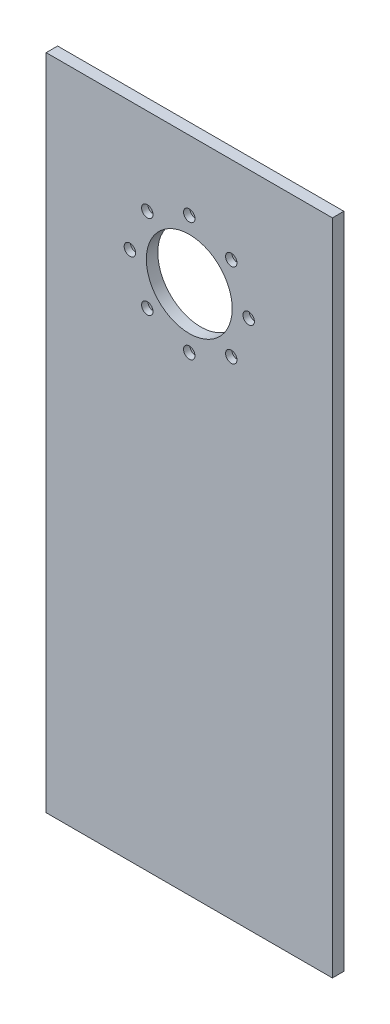
ISO-10303-21;
HEADER;
FILE_DESCRIPTION(('STEP AP214'),'2;1');
FILE_NAME('part.step','',(''),(''),'','','');
FILE_SCHEMA(('AUTOMOTIVE_DESIGN { 1 0 10303 214 1 1 1 1 }'));
ENDSEC;
DATA;
#1=APPLICATION_CONTEXT('core data for automotive mechanical design processes');
#2=APPLICATION_PROTOCOL_DEFINITION('international standard','automotive_design',2000,#1);
#3=PRODUCT_CONTEXT('',#1,'mechanical');
#4=PRODUCT('Part','Part','',(#3));
#5=PRODUCT_RELATED_PRODUCT_CATEGORY('part','',(#4));
#6=PRODUCT_DEFINITION_FORMATION('','',#4);
#7=PRODUCT_DEFINITION_CONTEXT('part definition',#1,'design');
#8=PRODUCT_DEFINITION('design','',#6,#7);
#9=PRODUCT_DEFINITION_SHAPE('','',#8);
#10=(LENGTH_UNIT() NAMED_UNIT(*) SI_UNIT(.MILLI.,.METRE.));
#11=(NAMED_UNIT(*) PLANE_ANGLE_UNIT() SI_UNIT($,.RADIAN.));
#12=(NAMED_UNIT(*) SI_UNIT($,.STERADIAN.) SOLID_ANGLE_UNIT());
#13=UNCERTAINTY_MEASURE_WITH_UNIT(LENGTH_MEASURE(1.E-05),#10,'distance_accuracy_value','');
#14=(GEOMETRIC_REPRESENTATION_CONTEXT(3) GLOBAL_UNCERTAINTY_ASSIGNED_CONTEXT((#13)) GLOBAL_UNIT_ASSIGNED_CONTEXT((#10,
#11,#12)) REPRESENTATION_CONTEXT('',''));
#15=CARTESIAN_POINT('',(0.,0.,0.));
#16=DIRECTION('',(0.,0.,1.));
#17=DIRECTION('',(1.,0.,0.));
#18=AXIS2_PLACEMENT_3D('',#15,#16,#17);
#19=CARTESIAN_POINT('',(29.3449314192411,399.344931419241,10.));
#20=DIRECTION('',(0.,0.,-1.));
#21=DIRECTION('',(-1.,0.,0.));
#22=AXIS2_PLACEMENT_3D('',#19,#20,#21);
#23=CYLINDRICAL_SURFACE('',#22,2.25000000000001);
#24=CARTESIAN_POINT('',(29.3449314192411,399.344931419241,0.));
#25=DIRECTION('',(0.,0.,-1.));
#26=DIRECTION('',(-1.,0.,0.));
#27=AXIS2_PLACEMENT_3D('',#24,#25,#26);
#28=CIRCLE('',#27,2.25000000000001);
#29=CARTESIAN_POINT('',(27.0949314192411,399.344931419241,0.));
#30=VERTEX_POINT('',#29);
#31=EDGE_CURVE('E134',#30,#30,#28,.T.);
#32=ORIENTED_EDGE('',*,*,#31,.T.);
#33=EDGE_LOOP('',(#32));
#34=FACE_BOUND('',#33,.T.);
#35=CARTESIAN_POINT('',(29.3449314192411,399.344931419241,3.6));
#36=DIRECTION('',(0.,0.,1.));
#37=DIRECTION('',(1.,0.,0.));
#38=AXIS2_PLACEMENT_3D('',#35,#36,#37);
#39=CIRCLE('',#38,2.25000000000001);
#40=CARTESIAN_POINT('',(31.5949314192411,399.344931419241,3.6));
#41=VERTEX_POINT('',#40);
#42=EDGE_CURVE('E39',#41,#41,#39,.F.);
#43=ORIENTED_EDGE('',*,*,#42,.F.);
#44=EDGE_LOOP('',(#43));
#45=FACE_BOUND('',#44,.T.);
#46=ADVANCED_FACE('F35',(#34,#45),#23,.F.);
#47=CARTESIAN_POINT('',(41.4999999999988,369.999999999999,10.));
#48=DIRECTION('',(0.,0.,-1.));
#49=DIRECTION('',(-1.,0.,0.));
#50=AXIS2_PLACEMENT_3D('',#47,#48,#49);
#51=CYLINDRICAL_SURFACE('',#50,2.25000000000001);
#52=CARTESIAN_POINT('',(41.4999999999988,369.999999999999,0.));
#53=DIRECTION('',(0.,0.,-1.));
#54=DIRECTION('',(-1.,0.,0.));
#55=AXIS2_PLACEMENT_3D('',#52,#53,#54);
#56=CIRCLE('',#55,2.25000000000001);
#57=CARTESIAN_POINT('',(39.2499999999988,369.999999999999,0.));
#58=VERTEX_POINT('',#57);
#59=EDGE_CURVE('E138',#58,#58,#56,.T.);
#60=ORIENTED_EDGE('',*,*,#59,.T.);
#61=EDGE_LOOP('',(#60));
#62=FACE_BOUND('',#61,.T.);
#63=CARTESIAN_POINT('',(41.4999999999988,369.999999999999,3.6));
#64=DIRECTION('',(0.,0.,1.));
#65=DIRECTION('',(1.,0.,0.));
#66=AXIS2_PLACEMENT_3D('',#63,#64,#65);
#67=CIRCLE('',#66,2.25000000000001);
#68=CARTESIAN_POINT('',(43.7499999999988,369.999999999999,3.6));
#69=VERTEX_POINT('',#68);
#70=EDGE_CURVE('E129',#69,#69,#67,.F.);
#71=ORIENTED_EDGE('',*,*,#70,.F.);
#72=EDGE_LOOP('',(#71));
#73=FACE_BOUND('',#72,.T.);
#74=ADVANCED_FACE('F175',(#62,#73),#51,.F.);
#75=CARTESIAN_POINT('',(29.3449314192399,340.655068580758,10.));
#76=DIRECTION('',(0.,0.,-1.));
#77=DIRECTION('',(-1.,0.,0.));
#78=AXIS2_PLACEMENT_3D('',#75,#76,#77);
#79=CYLINDRICAL_SURFACE('',#78,2.24999999999998);
#80=CARTESIAN_POINT('',(29.3449314192399,340.655068580758,0.));
#81=DIRECTION('',(0.,0.,-1.));
#82=DIRECTION('',(-1.,0.,0.));
#83=AXIS2_PLACEMENT_3D('',#80,#81,#82);
#84=CIRCLE('',#83,2.24999999999998);
#85=CARTESIAN_POINT('',(27.0949314192399,340.655068580758,0.));
#86=VERTEX_POINT('',#85);
#87=EDGE_CURVE('E143',#86,#86,#84,.T.);
#88=ORIENTED_EDGE('',*,*,#87,.T.);
#89=EDGE_LOOP('',(#88));
#90=FACE_BOUND('',#89,.T.);
#91=CARTESIAN_POINT('',(29.3449314192399,340.655068580758,3.6));
#92=DIRECTION('',(0.,0.,1.));
#93=DIRECTION('',(1.,0.,0.));
#94=AXIS2_PLACEMENT_3D('',#91,#92,#93);
#95=CIRCLE('',#94,2.24999999999998);
#96=CARTESIAN_POINT('',(31.5949314192399,340.655068580758,3.6));
#97=VERTEX_POINT('',#96);
#98=EDGE_CURVE('E127',#97,#97,#95,.F.);
#99=ORIENTED_EDGE('',*,*,#98,.F.);
#100=EDGE_LOOP('',(#99));
#101=FACE_BOUND('',#100,.T.);
#102=ADVANCED_FACE('F181',(#90,#101),#79,.F.);
#103=CARTESIAN_POINT('',(-2.04887979473371E-12,328.5,10.));
#104=DIRECTION('',(0.,0.,-1.));
#105=DIRECTION('',(-1.,0.,0.));
#106=AXIS2_PLACEMENT_3D('',#103,#104,#105);
#107=CYLINDRICAL_SURFACE('',#106,2.25000000000001);
#108=CARTESIAN_POINT('',(-2.04887979473371E-12,328.5,0.));
#109=DIRECTION('',(0.,0.,-1.));
#110=DIRECTION('',(-1.,0.,0.));
#111=AXIS2_PLACEMENT_3D('',#108,#109,#110);
#112=CIRCLE('',#111,2.25000000000001);
#113=CARTESIAN_POINT('',(-2.25000000000205,328.5,0.));
#114=VERTEX_POINT('',#113);
#115=EDGE_CURVE('E276',#114,#114,#112,.T.);
#116=ORIENTED_EDGE('',*,*,#115,.T.);
#117=EDGE_LOOP('',(#116));
#118=FACE_BOUND('',#117,.T.);
#119=CARTESIAN_POINT('',(-2.04887979473371E-12,328.5,3.6));
#120=DIRECTION('',(0.,0.,1.));
#121=DIRECTION('',(1.,0.,0.));
#122=AXIS2_PLACEMENT_3D('',#119,#120,#121);
#123=CIRCLE('',#122,2.25000000000001);
#124=CARTESIAN_POINT('',(2.24999999999796,328.5,3.6));
#125=VERTEX_POINT('',#124);
#126=EDGE_CURVE('E124',#125,#125,#123,.F.);
#127=ORIENTED_EDGE('',*,*,#126,.F.);
#128=EDGE_LOOP('',(#127));
#129=FACE_BOUND('',#128,.T.);
#130=ADVANCED_FACE('F262',(#118,#129),#107,.F.);
#131=CARTESIAN_POINT('',(-29.3449314192435,340.655068580759,10.));
#132=DIRECTION('',(0.,0.,-1.));
#133=DIRECTION('',(-1.,0.,0.));
#134=AXIS2_PLACEMENT_3D('',#131,#132,#133);
#135=CYLINDRICAL_SURFACE('',#134,2.24999999999998);
#136=CARTESIAN_POINT('',(-29.3449314192435,340.655068580759,0.));
#137=DIRECTION('',(0.,0.,-1.));
#138=DIRECTION('',(-1.,0.,0.));
#139=AXIS2_PLACEMENT_3D('',#136,#137,#138);
#140=CIRCLE('',#139,2.24999999999998);
#141=CARTESIAN_POINT('',(-31.5949314192435,340.655068580759,0.));
#142=VERTEX_POINT('',#141);
#143=EDGE_CURVE('E278',#142,#142,#140,.T.);
#144=ORIENTED_EDGE('',*,*,#143,.T.);
#145=EDGE_LOOP('',(#144));
#146=FACE_BOUND('',#145,.T.);
#147=CARTESIAN_POINT('',(-29.3449314192435,340.655068580759,3.6));
#148=DIRECTION('',(0.,0.,1.));
#149=DIRECTION('',(1.,0.,0.));
#150=AXIS2_PLACEMENT_3D('',#147,#148,#149);
#151=CIRCLE('',#150,2.24999999999998);
#152=CARTESIAN_POINT('',(-27.0949314192436,340.655068580759,3.6));
#153=VERTEX_POINT('',#152);
#154=EDGE_CURVE('E121',#153,#153,#151,.F.);
#155=ORIENTED_EDGE('',*,*,#154,.F.);
#156=EDGE_LOOP('',(#155));
#157=FACE_BOUND('',#156,.T.);
#158=ADVANCED_FACE('F258',(#146,#157),#135,.F.);
#159=CARTESIAN_POINT('',(-41.5000000000011,370.000000000001,10.));
#160=DIRECTION('',(0.,0.,-1.));
#161=DIRECTION('',(-1.,0.,0.));
#162=AXIS2_PLACEMENT_3D('',#159,#160,#161);
#163=CYLINDRICAL_SURFACE('',#162,2.25000000000001);
#164=CARTESIAN_POINT('',(-41.5000000000011,370.000000000001,0.));
#165=DIRECTION('',(0.,0.,-1.));
#166=DIRECTION('',(-1.,0.,0.));
#167=AXIS2_PLACEMENT_3D('',#164,#165,#166);
#168=CIRCLE('',#167,2.25000000000001);
#169=CARTESIAN_POINT('',(-43.7500000000012,370.000000000001,0.));
#170=VERTEX_POINT('',#169);
#171=EDGE_CURVE('E283',#170,#170,#168,.T.);
#172=ORIENTED_EDGE('',*,*,#171,.T.);
#173=EDGE_LOOP('',(#172));
#174=FACE_BOUND('',#173,.T.);
#175=CARTESIAN_POINT('',(-41.5000000000011,370.000000000001,3.6));
#176=DIRECTION('',(0.,0.,1.));
#177=DIRECTION('',(1.,0.,0.));
#178=AXIS2_PLACEMENT_3D('',#175,#176,#177);
#179=CIRCLE('',#178,2.25000000000001);
#180=CARTESIAN_POINT('',(-39.2500000000011,370.000000000001,3.6));
#181=VERTEX_POINT('',#180);
#182=EDGE_CURVE('E118',#181,#181,#179,.F.);
#183=ORIENTED_EDGE('',*,*,#182,.F.);
#184=EDGE_LOOP('',(#183));
#185=FACE_BOUND('',#184,.T.);
#186=ADVANCED_FACE('F254',(#174,#185),#163,.F.);
#187=CARTESIAN_POINT('',(-29.3449314192421,399.344931419243,10.));
#188=DIRECTION('',(0.,0.,-1.));
#189=DIRECTION('',(-1.,0.,0.));
#190=AXIS2_PLACEMENT_3D('',#187,#188,#189);
#191=CYLINDRICAL_SURFACE('',#190,2.24999999999998);
#192=CARTESIAN_POINT('',(-29.3449314192421,399.344931419243,0.));
#193=DIRECTION('',(0.,0.,-1.));
#194=DIRECTION('',(-1.,0.,0.));
#195=AXIS2_PLACEMENT_3D('',#192,#193,#194);
#196=CIRCLE('',#195,2.24999999999998);
#197=CARTESIAN_POINT('',(-31.5949314192421,399.344931419243,0.));
#198=VERTEX_POINT('',#197);
#199=EDGE_CURVE('E286',#198,#198,#196,.T.);
#200=ORIENTED_EDGE('',*,*,#199,.T.);
#201=EDGE_LOOP('',(#200));
#202=FACE_BOUND('',#201,.T.);
#203=CARTESIAN_POINT('',(-29.3449314192421,399.344931419243,3.6));
#204=DIRECTION('',(0.,0.,1.));
#205=DIRECTION('',(1.,0.,0.));
#206=AXIS2_PLACEMENT_3D('',#203,#204,#205);
#207=CIRCLE('',#206,2.24999999999998);
#208=CARTESIAN_POINT('',(-27.0949314192421,399.344931419243,3.6));
#209=VERTEX_POINT('',#208);
#210=EDGE_CURVE('E114',#209,#209,#207,.F.);
#211=ORIENTED_EDGE('',*,*,#210,.F.);
#212=EDGE_LOOP('',(#211));
#213=FACE_BOUND('',#212,.T.);
#214=ADVANCED_FACE('F250',(#202,#213),#191,.F.);
#215=CARTESIAN_POINT('',(0.,411.5,10.));
#216=DIRECTION('',(0.,0.,-1.));
#217=DIRECTION('',(-1.,0.,0.));
#218=AXIS2_PLACEMENT_3D('',#215,#216,#217);
#219=CYLINDRICAL_SURFACE('',#218,2.25);
#220=CARTESIAN_POINT('',(0.,411.5,0.));
#221=DIRECTION('',(0.,0.,-1.));
#222=DIRECTION('',(-1.,0.,0.));
#223=AXIS2_PLACEMENT_3D('',#220,#221,#222);
#224=CIRCLE('',#223,2.25);
#225=CARTESIAN_POINT('',(-2.25,411.5,0.));
#226=VERTEX_POINT('',#225);
#227=EDGE_CURVE('E150',#226,#226,#224,.T.);
#228=ORIENTED_EDGE('',*,*,#227,.T.);
#229=EDGE_LOOP('',(#228));
#230=FACE_BOUND('',#229,.T.);
#231=CARTESIAN_POINT('',(0.,411.5,3.6));
#232=DIRECTION('',(0.,0.,1.));
#233=DIRECTION('',(1.,0.,0.));
#234=AXIS2_PLACEMENT_3D('',#231,#232,#233);
#235=CIRCLE('',#234,2.25);
#236=CARTESIAN_POINT('',(2.25,411.5,3.6));
#237=VERTEX_POINT('',#236);
#238=EDGE_CURVE('E111',#237,#237,#235,.F.);
#239=ORIENTED_EDGE('',*,*,#238,.F.);
#240=EDGE_LOOP('',(#239));
#241=FACE_BOUND('',#240,.T.);
#242=ADVANCED_FACE('F248',(#230,#241),#219,.F.);
#243=CARTESIAN_POINT('',(-100.,460.,8.));
#244=DIRECTION('',(0.,-1.,0.));
#245=DIRECTION('',(0.,0.,-1.));
#246=AXIS2_PLACEMENT_3D('',#243,#244,#245);
#247=PLANE('',#246);
#248=DIRECTION('',(-1.,0.,0.));
#249=VECTOR('',#248,1.);
#250=CARTESIAN_POINT('',(-100.,460.,0.));
#251=LINE('',#250,#249);
#252=CARTESIAN_POINT('',(100.,460.,0.));
#253=VERTEX_POINT('',#252);
#254=CARTESIAN_POINT('',(-100.,460.,0.));
#255=VERTEX_POINT('',#254);
#256=EDGE_CURVE('E102',#253,#255,#251,.T.);
#257=ORIENTED_EDGE('',*,*,#256,.T.);
#258=DIRECTION('',(0.,0.,-1.));
#259=VECTOR('',#258,1.);
#260=CARTESIAN_POINT('',(-100.,460.,8.));
#261=LINE('',#260,#259);
#262=CARTESIAN_POINT('',(-100.,460.,8.));
#263=VERTEX_POINT('',#262);
#264=EDGE_CURVE('E11',#263,#255,#261,.T.);
#265=ORIENTED_EDGE('',*,*,#264,.F.);
#266=DIRECTION('',(-1.,0.,0.));
#267=VECTOR('',#266,1.);
#268=CARTESIAN_POINT('',(-100.,460.,8.));
#269=LINE('',#268,#267);
#270=CARTESIAN_POINT('',(100.,460.,8.));
#271=VERTEX_POINT('',#270);
#272=EDGE_CURVE('E89',#271,#263,#269,.T.);
#273=ORIENTED_EDGE('',*,*,#272,.F.);
#274=DIRECTION('',(0.,0.,-1.));
#275=VECTOR('',#274,1.);
#276=CARTESIAN_POINT('',(100.,460.,8.));
#277=LINE('',#276,#275);
#278=EDGE_CURVE('E98',#271,#253,#277,.T.);
#279=ORIENTED_EDGE('',*,*,#278,.T.);
#280=EDGE_LOOP('',(#257,#265,#273,#279));
#281=FACE_BOUND('',#280,.T.);
#282=ADVANCED_FACE('F37',(#281),#247,.F.);
#283=CARTESIAN_POINT('',(-100.,0.,8.));
#284=DIRECTION('',(1.,0.,0.));
#285=DIRECTION('',(0.,0.,-1.));
#286=AXIS2_PLACEMENT_3D('',#283,#284,#285);
#287=PLANE('',#286);
#288=DIRECTION('',(0.,-1.,0.));
#289=VECTOR('',#288,1.);
#290=CARTESIAN_POINT('',(-100.,0.,0.));
#291=LINE('',#290,#289);
#292=CARTESIAN_POINT('',(-100.,0.,0.));
#293=VERTEX_POINT('',#292);
#294=EDGE_CURVE('E93',#255,#293,#291,.T.);
#295=ORIENTED_EDGE('',*,*,#294,.T.);
#296=DIRECTION('',(0.,0.,-1.));
#297=VECTOR('',#296,1.);
#298=CARTESIAN_POINT('',(-100.,0.,8.));
#299=LINE('',#298,#297);
#300=CARTESIAN_POINT('',(-100.,0.,8.));
#301=VERTEX_POINT('',#300);
#302=EDGE_CURVE('E45',#301,#293,#299,.T.);
#303=ORIENTED_EDGE('',*,*,#302,.F.);
#304=DIRECTION('',(0.,-1.,0.));
#305=VECTOR('',#304,1.);
#306=CARTESIAN_POINT('',(-100.,0.,8.));
#307=LINE('',#306,#305);
#308=EDGE_CURVE('E84',#263,#301,#307,.T.);
#309=ORIENTED_EDGE('',*,*,#308,.F.);
#310=ORIENTED_EDGE('',*,*,#264,.T.);
#311=EDGE_LOOP('',(#295,#303,#309,#310));
#312=FACE_BOUND('',#311,.T.);
#313=ADVANCED_FACE('F92',(#312),#287,.F.);
#314=CARTESIAN_POINT('',(100.,0.,8.));
#315=DIRECTION('',(0.,1.,0.));
#316=DIRECTION('',(0.,0.,1.));
#317=AXIS2_PLACEMENT_3D('',#314,#315,#316);
#318=PLANE('',#317);
#319=DIRECTION('',(1.,0.,0.));
#320=VECTOR('',#319,1.);
#321=CARTESIAN_POINT('',(100.,0.,0.));
#322=LINE('',#321,#320);
#323=CARTESIAN_POINT('',(100.,0.,0.));
#324=VERTEX_POINT('',#323);
#325=EDGE_CURVE('E71',#293,#324,#322,.T.);
#326=ORIENTED_EDGE('',*,*,#325,.T.);
#327=DIRECTION('',(0.,0.,-1.));
#328=VECTOR('',#327,1.);
#329=CARTESIAN_POINT('',(100.,0.,8.));
#330=LINE('',#329,#328);
#331=CARTESIAN_POINT('',(100.,0.,8.));
#332=VERTEX_POINT('',#331);
#333=EDGE_CURVE('E94',#332,#324,#330,.T.);
#334=ORIENTED_EDGE('',*,*,#333,.F.);
#335=DIRECTION('',(1.,0.,0.));
#336=VECTOR('',#335,1.);
#337=CARTESIAN_POINT('',(100.,0.,8.));
#338=LINE('',#337,#336);
#339=EDGE_CURVE('E87',#301,#332,#338,.T.);
#340=ORIENTED_EDGE('',*,*,#339,.F.);
#341=ORIENTED_EDGE('',*,*,#302,.T.);
#342=EDGE_LOOP('',(#326,#334,#340,#341));
#343=FACE_BOUND('',#342,.T.);
#344=ADVANCED_FACE('F96',(#343),#318,.F.);
#345=CARTESIAN_POINT('',(100.,0.,8.));
#346=DIRECTION('',(-1.,0.,0.));
#347=DIRECTION('',(0.,0.,1.));
#348=AXIS2_PLACEMENT_3D('',#345,#346,#347);
#349=PLANE('',#348);
#350=DIRECTION('',(0.,1.,0.));
#351=VECTOR('',#350,1.);
#352=CARTESIAN_POINT('',(100.,0.,0.));
#353=LINE('',#352,#351);
#354=EDGE_CURVE('E77',#324,#253,#353,.T.);
#355=ORIENTED_EDGE('',*,*,#354,.T.);
#356=ORIENTED_EDGE('',*,*,#278,.F.);
#357=DIRECTION('',(0.,1.,0.));
#358=VECTOR('',#357,1.);
#359=CARTESIAN_POINT('',(100.,0.,8.));
#360=LINE('',#359,#358);
#361=EDGE_CURVE('E54',#332,#271,#360,.T.);
#362=ORIENTED_EDGE('',*,*,#361,.F.);
#363=ORIENTED_EDGE('',*,*,#333,.T.);
#364=EDGE_LOOP('',(#355,#356,#362,#363));
#365=FACE_BOUND('',#364,.T.);
#366=ADVANCED_FACE('F159',(#365),#349,.F.);
#367=CARTESIAN_POINT('',(0.,0.,8.));
#368=DIRECTION('',(0.,0.,1.));
#369=DIRECTION('',(1.,0.,0.));
#370=AXIS2_PLACEMENT_3D('',#367,#368,#369);
#371=PLANE('',#370);
#372=CARTESIAN_POINT('',(41.4999999999996,370.,8.));
#373=DIRECTION('',(0.,0.,1.));
#374=DIRECTION('',(1.,0.,0.));
#375=AXIS2_PLACEMENT_3D('',#372,#373,#374);
#376=CIRCLE('',#375,4.00000000000001);
#377=CARTESIAN_POINT('',(45.4999999999996,370.,8.));
#378=VERTEX_POINT('',#377);
#379=EDGE_CURVE('E316',#378,#378,#376,.T.);
#380=ORIENTED_EDGE('',*,*,#379,.F.);
#381=EDGE_LOOP('',(#380));
#382=FACE_BOUND('',#381,.T.);
#383=CARTESIAN_POINT('',(29.3449314192419,340.655068580759,8.));
#384=DIRECTION('',(0.,0.,1.));
#385=DIRECTION('',(1.,0.,0.));
#386=AXIS2_PLACEMENT_3D('',#383,#384,#385);
#387=CIRCLE('',#386,4.00000000000005);
#388=CARTESIAN_POINT('',(33.3449314192419,340.655068580759,8.));
#389=VERTEX_POINT('',#388);
#390=EDGE_CURVE('E310',#389,#389,#387,.T.);
#391=ORIENTED_EDGE('',*,*,#390,.F.);
#392=EDGE_LOOP('',(#391));
#393=FACE_BOUND('',#392,.T.);
#394=CARTESIAN_POINT('',(8.32667268468867E-13,328.500000000001,8.));
#395=DIRECTION('',(0.,0.,1.));
#396=DIRECTION('',(1.,0.,0.));
#397=AXIS2_PLACEMENT_3D('',#394,#395,#396);
#398=CIRCLE('',#397,4.00000000000006);
#399=CARTESIAN_POINT('',(4.00000000000089,328.500000000001,8.));
#400=VERTEX_POINT('',#399);
#401=EDGE_CURVE('E304',#400,#400,#398,.T.);
#402=ORIENTED_EDGE('',*,*,#401,.F.);
#403=EDGE_LOOP('',(#402));
#404=FACE_BOUND('',#403,.T.);
#405=CARTESIAN_POINT('',(-29.3449314192405,340.655068580758,8.));
#406=DIRECTION('',(0.,0.,1.));
#407=DIRECTION('',(1.,0.,0.));
#408=AXIS2_PLACEMENT_3D('',#405,#406,#407);
#409=CIRCLE('',#408,4.00000000000001);
#410=CARTESIAN_POINT('',(-25.3449314192405,340.655068580758,8.));
#411=VERTEX_POINT('',#410);
#412=EDGE_CURVE('E297',#411,#411,#409,.T.);
#413=ORIENTED_EDGE('',*,*,#412,.F.);
#414=EDGE_LOOP('',(#413));
#415=FACE_BOUND('',#414,.T.);
#416=CARTESIAN_POINT('',(-41.4999999999988,369.999999999999,8.));
#417=DIRECTION('',(0.,0.,1.));
#418=DIRECTION('',(1.,0.,0.));
#419=AXIS2_PLACEMENT_3D('',#416,#417,#418);
#420=CIRCLE('',#419,3.99999999999996);
#421=CARTESIAN_POINT('',(-37.4999999999989,369.999999999999,8.));
#422=VERTEX_POINT('',#421);
#423=EDGE_CURVE('E332',#422,#422,#420,.T.);
#424=ORIENTED_EDGE('',*,*,#423,.F.);
#425=EDGE_LOOP('',(#424));
#426=FACE_BOUND('',#425,.T.);
#427=CARTESIAN_POINT('',(-29.3449314192408,399.344931419241,8.));
#428=DIRECTION('',(0.,0.,1.));
#429=DIRECTION('',(1.,0.,0.));
#430=AXIS2_PLACEMENT_3D('',#427,#428,#429);
#431=CIRCLE('',#430,4.00000000000005);
#432=CARTESIAN_POINT('',(-25.3449314192408,399.344931419241,8.));
#433=VERTEX_POINT('',#432);
#434=EDGE_CURVE('E326',#433,#433,#431,.T.);
#435=ORIENTED_EDGE('',*,*,#434,.F.);
#436=EDGE_LOOP('',(#435));
#437=FACE_BOUND('',#436,.T.);
#438=CARTESIAN_POINT('',(2.77555756156289E-13,411.499999999999,8.));
#439=DIRECTION('',(0.,0.,1.));
#440=DIRECTION('',(1.,0.,0.));
#441=AXIS2_PLACEMENT_3D('',#438,#439,#440);
#442=CIRCLE('',#441,3.99999999999998);
#443=CARTESIAN_POINT('',(4.00000000000026,411.499999999999,8.));
#444=VERTEX_POINT('',#443);
#445=EDGE_CURVE('E321',#444,#444,#442,.T.);
#446=ORIENTED_EDGE('',*,*,#445,.F.);
#447=EDGE_LOOP('',(#446));
#448=FACE_BOUND('',#447,.T.);
#449=CARTESIAN_POINT('',(29.3449314192411,399.344931419241,8.));
#450=DIRECTION('',(0.,0.,1.));
#451=DIRECTION('',(1.,0.,0.));
#452=AXIS2_PLACEMENT_3D('',#449,#450,#451);
#453=CIRCLE('',#452,4.00000000000001);
#454=CARTESIAN_POINT('',(33.3449314192411,399.344931419241,8.));
#455=VERTEX_POINT('',#454);
#456=EDGE_CURVE('E291',#455,#455,#453,.T.);
#457=ORIENTED_EDGE('',*,*,#456,.F.);
#458=EDGE_LOOP('',(#457));
#459=FACE_BOUND('',#458,.T.);
#460=CARTESIAN_POINT('',(0.,370.,8.));
#461=DIRECTION('',(0.,0.,1.));
#462=DIRECTION('',(1.,0.,0.));
#463=AXIS2_PLACEMENT_3D('',#460,#461,#462);
#464=CIRCLE('',#463,30.);
#465=CARTESIAN_POINT('',(30.,370.,8.));
#466=VERTEX_POINT('',#465);
#467=EDGE_CURVE('E105',#466,#466,#464,.T.);
#468=ORIENTED_EDGE('',*,*,#467,.F.);
#469=EDGE_LOOP('',(#468));
#470=FACE_BOUND('',#469,.T.);
#471=ORIENTED_EDGE('',*,*,#272,.T.);
#472=ORIENTED_EDGE('',*,*,#308,.T.);
#473=ORIENTED_EDGE('',*,*,#339,.T.);
#474=ORIENTED_EDGE('',*,*,#361,.T.);
#475=EDGE_LOOP('',(#471,#472,#473,#474));
#476=FACE_BOUND('',#475,.T.);
#477=ADVANCED_FACE('F85',(#382,#393,#404,#415,#426,#437,#448,#459,#470,#476),#371,.T.);
#478=CARTESIAN_POINT('',(0.,0.,0.));
#479=DIRECTION('',(0.,0.,1.));
#480=DIRECTION('',(1.,0.,0.));
#481=AXIS2_PLACEMENT_3D('',#478,#479,#480);
#482=PLANE('',#481);
#483=ORIENTED_EDGE('',*,*,#227,.F.);
#484=EDGE_LOOP('',(#483));
#485=FACE_BOUND('',#484,.T.);
#486=ORIENTED_EDGE('',*,*,#199,.F.);
#487=EDGE_LOOP('',(#486));
#488=FACE_BOUND('',#487,.T.);
#489=ORIENTED_EDGE('',*,*,#171,.F.);
#490=EDGE_LOOP('',(#489));
#491=FACE_BOUND('',#490,.T.);
#492=ORIENTED_EDGE('',*,*,#143,.F.);
#493=EDGE_LOOP('',(#492));
#494=FACE_BOUND('',#493,.T.);
#495=ORIENTED_EDGE('',*,*,#115,.F.);
#496=EDGE_LOOP('',(#495));
#497=FACE_BOUND('',#496,.T.);
#498=ORIENTED_EDGE('',*,*,#87,.F.);
#499=EDGE_LOOP('',(#498));
#500=FACE_BOUND('',#499,.T.);
#501=ORIENTED_EDGE('',*,*,#59,.F.);
#502=EDGE_LOOP('',(#501));
#503=FACE_BOUND('',#502,.T.);
#504=ORIENTED_EDGE('',*,*,#31,.F.);
#505=EDGE_LOOP('',(#504));
#506=FACE_BOUND('',#505,.T.);
#507=CARTESIAN_POINT('',(0.,370.,0.));
#508=DIRECTION('',(0.,0.,-1.));
#509=DIRECTION('',(-1.,0.,0.));
#510=AXIS2_PLACEMENT_3D('',#507,#508,#509);
#511=CIRCLE('',#510,30.);
#512=CARTESIAN_POINT('',(-30.,370.,0.));
#513=VERTEX_POINT('',#512);
#514=EDGE_CURVE('E147',#513,#513,#511,.T.);
#515=ORIENTED_EDGE('',*,*,#514,.F.);
#516=EDGE_LOOP('',(#515));
#517=FACE_BOUND('',#516,.T.);
#518=ORIENTED_EDGE('',*,*,#256,.F.);
#519=ORIENTED_EDGE('',*,*,#354,.F.);
#520=ORIENTED_EDGE('',*,*,#325,.F.);
#521=ORIENTED_EDGE('',*,*,#294,.F.);
#522=EDGE_LOOP('',(#518,#519,#520,#521));
#523=FACE_BOUND('',#522,.T.);
#524=ADVANCED_FACE('F158',(#485,#488,#491,#494,#497,#500,#503,#506,#517,#523),#482,.F.);
#525=CARTESIAN_POINT('',(0.,370.,10.));
#526=DIRECTION('',(0.,0.,-1.));
#527=DIRECTION('',(-1.,0.,0.));
#528=AXIS2_PLACEMENT_3D('',#525,#526,#527);
#529=CYLINDRICAL_SURFACE('',#528,30.);
#530=ORIENTED_EDGE('',*,*,#467,.T.);
#531=EDGE_LOOP('',(#530));
#532=FACE_BOUND('',#531,.T.);
#533=ORIENTED_EDGE('',*,*,#514,.T.);
#534=EDGE_LOOP('',(#533));
#535=FACE_BOUND('',#534,.T.);
#536=ADVANCED_FACE('F154',(#532,#535),#529,.F.);
#537=CARTESIAN_POINT('',(2.77555756156289E-13,411.499999999999,3.6));
#538=DIRECTION('',(0.,0.,1.));
#539=DIRECTION('',(1.,0.,0.));
#540=AXIS2_PLACEMENT_3D('',#537,#538,#539);
#541=PLANE('',#540);
#542=CARTESIAN_POINT('',(2.77555756156289E-13,411.499999999999,3.6));
#543=DIRECTION('',(0.,0.,1.));
#544=DIRECTION('',(1.,0.,0.));
#545=AXIS2_PLACEMENT_3D('',#542,#543,#544);
#546=CIRCLE('',#545,3.99999999999998);
#547=CARTESIAN_POINT('',(4.00000000000026,411.499999999999,3.6));
#548=VERTEX_POINT('',#547);
#549=EDGE_CURVE('E324',#548,#548,#546,.T.);
#550=ORIENTED_EDGE('',*,*,#549,.T.);
#551=EDGE_LOOP('',(#550));
#552=FACE_BOUND('',#551,.T.);
#553=ORIENTED_EDGE('',*,*,#238,.T.);
#554=EDGE_LOOP('',(#553));
#555=FACE_BOUND('',#554,.T.);
#556=ADVANCED_FACE('F187',(#552,#555),#541,.T.);
#557=CARTESIAN_POINT('',(2.77555756156289E-13,411.499999999999,3.6));
#558=DIRECTION('',(0.,0.,1.));
#559=DIRECTION('',(1.,0.,0.));
#560=AXIS2_PLACEMENT_3D('',#557,#558,#559);
#561=CYLINDRICAL_SURFACE('',#560,3.99999999999998);
#562=ORIENTED_EDGE('',*,*,#549,.F.);
#563=EDGE_LOOP('',(#562));
#564=FACE_BOUND('',#563,.T.);
#565=ORIENTED_EDGE('',*,*,#445,.T.);
#566=EDGE_LOOP('',(#565));
#567=FACE_BOUND('',#566,.T.);
#568=ADVANCED_FACE('F192',(#564,#567),#561,.F.);
#569=CARTESIAN_POINT('',(-29.3449314192408,399.344931419241,3.6));
#570=DIRECTION('',(0.,0.,1.));
#571=DIRECTION('',(1.,0.,0.));
#572=AXIS2_PLACEMENT_3D('',#569,#570,#571);
#573=PLANE('',#572);
#574=CARTESIAN_POINT('',(-29.3449314192408,399.344931419241,3.6));
#575=DIRECTION('',(0.,0.,1.));
#576=DIRECTION('',(1.,0.,0.));
#577=AXIS2_PLACEMENT_3D('',#574,#575,#576);
#578=CIRCLE('',#577,4.00000000000005);
#579=CARTESIAN_POINT('',(-25.3449314192408,399.344931419241,3.6));
#580=VERTEX_POINT('',#579);
#581=EDGE_CURVE('E329',#580,#580,#578,.T.);
#582=ORIENTED_EDGE('',*,*,#581,.T.);
#583=EDGE_LOOP('',(#582));
#584=FACE_BOUND('',#583,.T.);
#585=ORIENTED_EDGE('',*,*,#210,.T.);
#586=EDGE_LOOP('',(#585));
#587=FACE_BOUND('',#586,.T.);
#588=ADVANCED_FACE('F198',(#584,#587),#573,.T.);
#589=CARTESIAN_POINT('',(-29.3449314192408,399.344931419241,3.6));
#590=DIRECTION('',(0.,0.,1.));
#591=DIRECTION('',(1.,0.,0.));
#592=AXIS2_PLACEMENT_3D('',#589,#590,#591);
#593=CYLINDRICAL_SURFACE('',#592,4.00000000000005);
#594=ORIENTED_EDGE('',*,*,#581,.F.);
#595=EDGE_LOOP('',(#594));
#596=FACE_BOUND('',#595,.T.);
#597=ORIENTED_EDGE('',*,*,#434,.T.);
#598=EDGE_LOOP('',(#597));
#599=FACE_BOUND('',#598,.T.);
#600=ADVANCED_FACE('F204',(#596,#599),#593,.F.);
#601=CARTESIAN_POINT('',(-41.4999999999988,369.999999999999,3.6));
#602=DIRECTION('',(0.,0.,1.));
#603=DIRECTION('',(1.,0.,0.));
#604=AXIS2_PLACEMENT_3D('',#601,#602,#603);
#605=PLANE('',#604);
#606=CARTESIAN_POINT('',(-41.4999999999988,369.999999999999,3.6));
#607=DIRECTION('',(0.,0.,1.));
#608=DIRECTION('',(1.,0.,0.));
#609=AXIS2_PLACEMENT_3D('',#606,#607,#608);
#610=CIRCLE('',#609,3.99999999999996);
#611=CARTESIAN_POINT('',(-37.4999999999989,369.999999999999,3.6));
#612=VERTEX_POINT('',#611);
#613=EDGE_CURVE('E301',#612,#612,#610,.T.);
#614=ORIENTED_EDGE('',*,*,#613,.T.);
#615=EDGE_LOOP('',(#614));
#616=FACE_BOUND('',#615,.T.);
#617=ORIENTED_EDGE('',*,*,#182,.T.);
#618=EDGE_LOOP('',(#617));
#619=FACE_BOUND('',#618,.T.);
#620=ADVANCED_FACE('F338',(#616,#619),#605,.T.);
#621=CARTESIAN_POINT('',(-41.4999999999988,369.999999999999,3.6));
#622=DIRECTION('',(0.,0.,1.));
#623=DIRECTION('',(1.,0.,0.));
#624=AXIS2_PLACEMENT_3D('',#621,#622,#623);
#625=CYLINDRICAL_SURFACE('',#624,3.99999999999996);
#626=ORIENTED_EDGE('',*,*,#613,.F.);
#627=EDGE_LOOP('',(#626));
#628=FACE_BOUND('',#627,.T.);
#629=ORIENTED_EDGE('',*,*,#423,.T.);
#630=EDGE_LOOP('',(#629));
#631=FACE_BOUND('',#630,.T.);
#632=ADVANCED_FACE('F236',(#628,#631),#625,.F.);
#633=CARTESIAN_POINT('',(-29.3449314192405,340.655068580758,3.6));
#634=DIRECTION('',(0.,0.,1.));
#635=DIRECTION('',(1.,0.,0.));
#636=AXIS2_PLACEMENT_3D('',#633,#634,#635);
#637=PLANE('',#636);
#638=CARTESIAN_POINT('',(-29.3449314192405,340.655068580758,3.6));
#639=DIRECTION('',(0.,0.,1.));
#640=DIRECTION('',(1.,0.,0.));
#641=AXIS2_PLACEMENT_3D('',#638,#639,#640);
#642=CIRCLE('',#641,4.00000000000001);
#643=CARTESIAN_POINT('',(-25.3449314192405,340.655068580758,3.6));
#644=VERTEX_POINT('',#643);
#645=EDGE_CURVE('E300',#644,#644,#642,.T.);
#646=ORIENTED_EDGE('',*,*,#645,.T.);
#647=EDGE_LOOP('',(#646));
#648=FACE_BOUND('',#647,.T.);
#649=ORIENTED_EDGE('',*,*,#154,.T.);
#650=EDGE_LOOP('',(#649));
#651=FACE_BOUND('',#650,.T.);
#652=ADVANCED_FACE('F233',(#648,#651),#637,.T.);
#653=CARTESIAN_POINT('',(-29.3449314192405,340.655068580758,3.6));
#654=DIRECTION('',(0.,0.,1.));
#655=DIRECTION('',(1.,0.,0.));
#656=AXIS2_PLACEMENT_3D('',#653,#654,#655);
#657=CYLINDRICAL_SURFACE('',#656,4.00000000000001);
#658=ORIENTED_EDGE('',*,*,#645,.F.);
#659=EDGE_LOOP('',(#658));
#660=FACE_BOUND('',#659,.T.);
#661=ORIENTED_EDGE('',*,*,#412,.T.);
#662=EDGE_LOOP('',(#661));
#663=FACE_BOUND('',#662,.T.);
#664=ADVANCED_FACE('F228',(#660,#663),#657,.F.);
#665=CARTESIAN_POINT('',(8.32667268468867E-13,328.500000000001,3.6));
#666=DIRECTION('',(0.,0.,1.));
#667=DIRECTION('',(1.,0.,0.));
#668=AXIS2_PLACEMENT_3D('',#665,#666,#667);
#669=PLANE('',#668);
#670=CARTESIAN_POINT('',(8.32667268468867E-13,328.500000000001,3.6));
#671=DIRECTION('',(0.,0.,1.));
#672=DIRECTION('',(1.,0.,0.));
#673=AXIS2_PLACEMENT_3D('',#670,#671,#672);
#674=CIRCLE('',#673,4.00000000000006);
#675=CARTESIAN_POINT('',(4.00000000000089,328.500000000001,3.6));
#676=VERTEX_POINT('',#675);
#677=EDGE_CURVE('E307',#676,#676,#674,.T.);
#678=ORIENTED_EDGE('',*,*,#677,.T.);
#679=EDGE_LOOP('',(#678));
#680=FACE_BOUND('',#679,.T.);
#681=ORIENTED_EDGE('',*,*,#126,.T.);
#682=EDGE_LOOP('',(#681));
#683=FACE_BOUND('',#682,.T.);
#684=ADVANCED_FACE('F225',(#680,#683),#669,.T.);
#685=CARTESIAN_POINT('',(8.32667268468867E-13,328.500000000001,3.6));
#686=DIRECTION('',(0.,0.,1.));
#687=DIRECTION('',(1.,0.,0.));
#688=AXIS2_PLACEMENT_3D('',#685,#686,#687);
#689=CYLINDRICAL_SURFACE('',#688,4.00000000000006);
#690=ORIENTED_EDGE('',*,*,#677,.F.);
#691=EDGE_LOOP('',(#690));
#692=FACE_BOUND('',#691,.T.);
#693=ORIENTED_EDGE('',*,*,#401,.T.);
#694=EDGE_LOOP('',(#693));
#695=FACE_BOUND('',#694,.T.);
#696=ADVANCED_FACE('F220',(#692,#695),#689,.F.);
#697=CARTESIAN_POINT('',(29.3449314192419,340.655068580759,3.6));
#698=DIRECTION('',(0.,0.,1.));
#699=DIRECTION('',(1.,0.,0.));
#700=AXIS2_PLACEMENT_3D('',#697,#698,#699);
#701=PLANE('',#700);
#702=CARTESIAN_POINT('',(29.3449314192419,340.655068580759,3.6));
#703=DIRECTION('',(0.,0.,1.));
#704=DIRECTION('',(1.,0.,0.));
#705=AXIS2_PLACEMENT_3D('',#702,#703,#704);
#706=CIRCLE('',#705,4.00000000000005);
#707=CARTESIAN_POINT('',(33.3449314192419,340.655068580759,3.6));
#708=VERTEX_POINT('',#707);
#709=EDGE_CURVE('E313',#708,#708,#706,.T.);
#710=ORIENTED_EDGE('',*,*,#709,.T.);
#711=EDGE_LOOP('',(#710));
#712=FACE_BOUND('',#711,.T.);
#713=ORIENTED_EDGE('',*,*,#98,.T.);
#714=EDGE_LOOP('',(#713));
#715=FACE_BOUND('',#714,.T.);
#716=ADVANCED_FACE('F217',(#712,#715),#701,.T.);
#717=CARTESIAN_POINT('',(29.3449314192419,340.655068580759,3.6));
#718=DIRECTION('',(0.,0.,1.));
#719=DIRECTION('',(1.,0.,0.));
#720=AXIS2_PLACEMENT_3D('',#717,#718,#719);
#721=CYLINDRICAL_SURFACE('',#720,4.00000000000005);
#722=ORIENTED_EDGE('',*,*,#709,.F.);
#723=EDGE_LOOP('',(#722));
#724=FACE_BOUND('',#723,.T.);
#725=ORIENTED_EDGE('',*,*,#390,.T.);
#726=EDGE_LOOP('',(#725));
#727=FACE_BOUND('',#726,.T.);
#728=ADVANCED_FACE('F211',(#724,#727),#721,.F.);
#729=CARTESIAN_POINT('',(41.4999999999996,370.,3.6));
#730=DIRECTION('',(0.,0.,1.));
#731=DIRECTION('',(1.,0.,0.));
#732=AXIS2_PLACEMENT_3D('',#729,#730,#731);
#733=PLANE('',#732);
#734=CARTESIAN_POINT('',(41.4999999999996,370.,3.6));
#735=DIRECTION('',(0.,0.,1.));
#736=DIRECTION('',(1.,0.,0.));
#737=AXIS2_PLACEMENT_3D('',#734,#735,#736);
#738=CIRCLE('',#737,4.00000000000001);
#739=CARTESIAN_POINT('',(45.4999999999996,370.,3.6));
#740=VERTEX_POINT('',#739);
#741=EDGE_CURVE('E294',#740,#740,#738,.T.);
#742=ORIENTED_EDGE('',*,*,#741,.T.);
#743=EDGE_LOOP('',(#742));
#744=FACE_BOUND('',#743,.T.);
#745=ORIENTED_EDGE('',*,*,#70,.T.);
#746=EDGE_LOOP('',(#745));
#747=FACE_BOUND('',#746,.T.);
#748=ADVANCED_FACE('F207',(#744,#747),#733,.T.);
#749=CARTESIAN_POINT('',(41.4999999999996,370.,3.6));
#750=DIRECTION('',(0.,0.,1.));
#751=DIRECTION('',(1.,0.,0.));
#752=AXIS2_PLACEMENT_3D('',#749,#750,#751);
#753=CYLINDRICAL_SURFACE('',#752,4.00000000000001);
#754=ORIENTED_EDGE('',*,*,#741,.F.);
#755=EDGE_LOOP('',(#754));
#756=FACE_BOUND('',#755,.T.);
#757=ORIENTED_EDGE('',*,*,#379,.T.);
#758=EDGE_LOOP('',(#757));
#759=FACE_BOUND('',#758,.T.);
#760=ADVANCED_FACE('F210',(#756,#759),#753,.F.);
#761=CARTESIAN_POINT('',(29.3449314192411,399.344931419241,3.6));
#762=DIRECTION('',(0.,0.,1.));
#763=DIRECTION('',(1.,0.,0.));
#764=AXIS2_PLACEMENT_3D('',#761,#762,#763);
#765=PLANE('',#764);
#766=CARTESIAN_POINT('',(29.3449314192411,399.344931419241,3.6));
#767=DIRECTION('',(0.,0.,1.));
#768=DIRECTION('',(1.,0.,0.));
#769=AXIS2_PLACEMENT_3D('',#766,#767,#768);
#770=CIRCLE('',#769,4.00000000000001);
#771=CARTESIAN_POINT('',(33.3449314192411,399.344931419241,3.6));
#772=VERTEX_POINT('',#771);
#773=EDGE_CURVE('E115',#772,#772,#770,.T.);
#774=ORIENTED_EDGE('',*,*,#773,.T.);
#775=EDGE_LOOP('',(#774));
#776=FACE_BOUND('',#775,.T.);
#777=ORIENTED_EDGE('',*,*,#42,.T.);
#778=EDGE_LOOP('',(#777));
#779=FACE_BOUND('',#778,.T.);
#780=ADVANCED_FACE('F215',(#776,#779),#765,.T.);
#781=CARTESIAN_POINT('',(29.3449314192411,399.344931419241,3.6));
#782=DIRECTION('',(0.,0.,1.));
#783=DIRECTION('',(1.,0.,0.));
#784=AXIS2_PLACEMENT_3D('',#781,#782,#783);
#785=CYLINDRICAL_SURFACE('',#784,4.00000000000001);
#786=ORIENTED_EDGE('',*,*,#773,.F.);
#787=EDGE_LOOP('',(#786));
#788=FACE_BOUND('',#787,.T.);
#789=ORIENTED_EDGE('',*,*,#456,.T.);
#790=EDGE_LOOP('',(#789));
#791=FACE_BOUND('',#790,.T.);
#792=ADVANCED_FACE('F243',(#788,#791),#785,.F.);
#793=CLOSED_SHELL('',(#46,#74,#102,#130,#158,#186,#214,#242,#282,#313,#344,#366,#477,#524,#536,
#556,#568,#588,#600,#620,#632,#652,#664,#684,#696,#716,#728,#748,#760,#780,#792));
#794=MANIFOLD_SOLID_BREP('B2',#793);
#795=ADVANCED_BREP_SHAPE_REPRESENTATION('',(#18,#794),#14);
#796=SHAPE_DEFINITION_REPRESENTATION(#9,#795);
ENDSEC;
END-ISO-10303-21;
